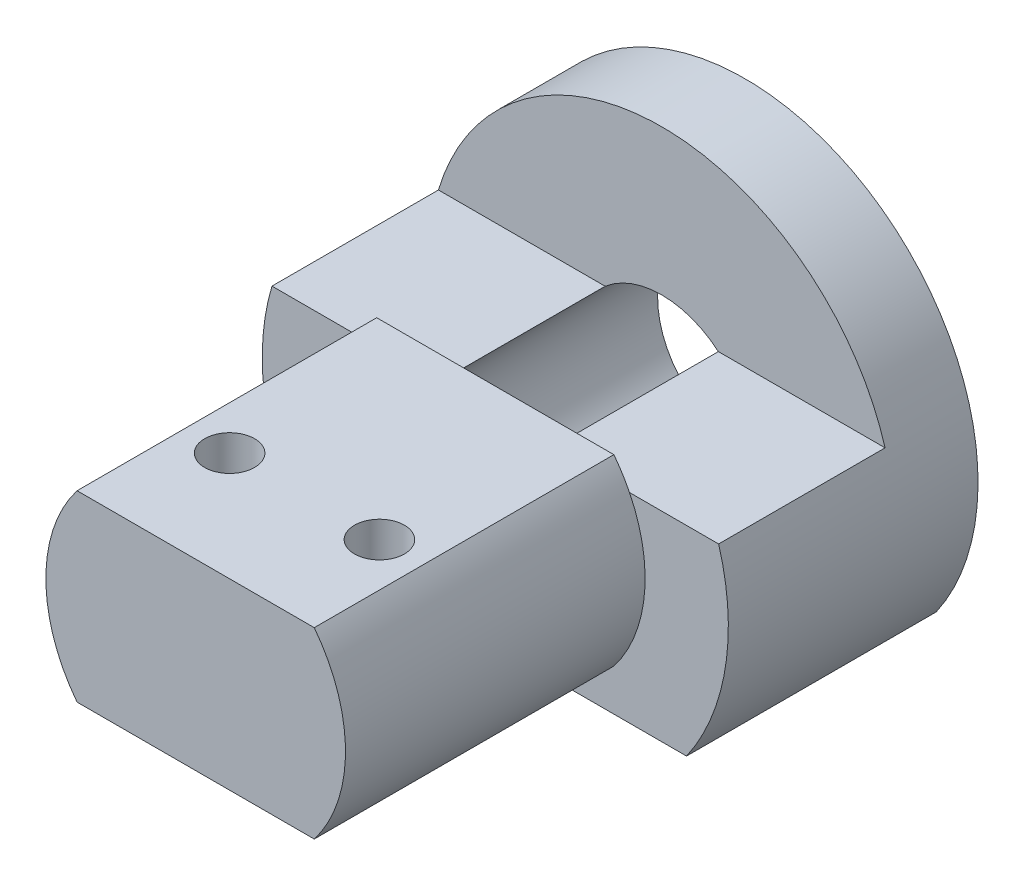
ISO-10303-21;
HEADER;
FILE_DESCRIPTION(('STEP AP214'),'2;1');
FILE_NAME('part.step','',(''),(''),'','','');
FILE_SCHEMA(('AUTOMOTIVE_DESIGN { 1 0 10303 214 1 1 1 1 }'));
ENDSEC;
DATA;
#1=APPLICATION_CONTEXT('core data for automotive mechanical design processes');
#2=APPLICATION_PROTOCOL_DEFINITION('international standard','automotive_design',2000,#1);
#3=PRODUCT_CONTEXT('',#1,'mechanical');
#4=PRODUCT('Part','Part','',(#3));
#5=PRODUCT_RELATED_PRODUCT_CATEGORY('part','',(#4));
#6=PRODUCT_DEFINITION_FORMATION('','',#4);
#7=PRODUCT_DEFINITION_CONTEXT('part definition',#1,'design');
#8=PRODUCT_DEFINITION('design','',#6,#7);
#9=PRODUCT_DEFINITION_SHAPE('','',#8);
#10=(LENGTH_UNIT() NAMED_UNIT(*) SI_UNIT(.MILLI.,.METRE.));
#11=(NAMED_UNIT(*) PLANE_ANGLE_UNIT() SI_UNIT($,.RADIAN.));
#12=(NAMED_UNIT(*) SI_UNIT($,.STERADIAN.) SOLID_ANGLE_UNIT());
#13=UNCERTAINTY_MEASURE_WITH_UNIT(LENGTH_MEASURE(1.E-05),#10,'distance_accuracy_value','');
#14=(GEOMETRIC_REPRESENTATION_CONTEXT(3) GLOBAL_UNCERTAINTY_ASSIGNED_CONTEXT((#13)) GLOBAL_UNIT_ASSIGNED_CONTEXT((#10,
#11,#12)) REPRESENTATION_CONTEXT('',''));
#15=CARTESIAN_POINT('',(0.,0.,0.));
#16=DIRECTION('',(0.,0.,1.));
#17=DIRECTION('',(1.,0.,0.));
#18=AXIS2_PLACEMENT_3D('',#15,#16,#17);
#19=CARTESIAN_POINT('',(0.,0.,15.));
#20=DIRECTION('',(0.,0.,1.));
#21=DIRECTION('',(1.,0.,0.));
#22=AXIS2_PLACEMENT_3D('',#19,#20,#21);
#23=PLANE('',#22);
#24=CARTESIAN_POINT('',(0.,0.,15.));
#25=DIRECTION('',(0.,0.,1.));
#26=DIRECTION('',(1.,0.,0.));
#27=AXIS2_PLACEMENT_3D('',#24,#25,#26);
#28=CIRCLE('',#27,9.);
#29=CARTESIAN_POINT('',(-8.06225774829855,4.,15.));
#30=VERTEX_POINT('',#29);
#31=CARTESIAN_POINT('',(-7.1239034243875,-5.5,15.));
#32=VERTEX_POINT('',#31);
#33=EDGE_CURVE('E11',#30,#32,#28,.T.);
#34=ORIENTED_EDGE('',*,*,#33,.F.);
#35=DIRECTION('',(1.,0.,0.));
#36=VECTOR('',#35,1.);
#37=CARTESIAN_POINT('',(-13.4164078649987,4.,15.));
#38=LINE('',#37,#36);
#39=CARTESIAN_POINT('',(-13.4164078649987,4.,15.));
#40=VERTEX_POINT('',#39);
#41=EDGE_CURVE('E145',#40,#30,#38,.T.);
#42=ORIENTED_EDGE('',*,*,#41,.F.);
#43=CARTESIAN_POINT('',(0.,0.,15.));
#44=DIRECTION('',(0.,0.,1.));
#45=DIRECTION('',(1.,0.,0.));
#46=AXIS2_PLACEMENT_3D('',#43,#44,#45);
#47=CIRCLE('',#46,14.);
#48=CARTESIAN_POINT('',(-11.4891252930761,-8.,15.));
#49=VERTEX_POINT('',#48);
#50=EDGE_CURVE('E171',#40,#49,#47,.T.);
#51=ORIENTED_EDGE('',*,*,#50,.T.);
#52=DIRECTION('',(1.,0.,0.));
#53=VECTOR('',#52,1.);
#54=CARTESIAN_POINT('',(-11.4891252930761,-8.,15.));
#55=LINE('',#54,#53);
#56=CARTESIAN_POINT('',(11.4891252930761,-8.,15.));
#57=VERTEX_POINT('',#56);
#58=EDGE_CURVE('E170',#49,#57,#55,.T.);
#59=ORIENTED_EDGE('',*,*,#58,.T.);
#60=CARTESIAN_POINT('',(13.4164078649987,4.,15.));
#61=VERTEX_POINT('',#60);
#62=EDGE_CURVE('E168',#57,#61,#47,.T.);
#63=ORIENTED_EDGE('',*,*,#62,.T.);
#64=CARTESIAN_POINT('',(8.06225774829855,4.,15.));
#65=VERTEX_POINT('',#64);
#66=EDGE_CURVE('E57',#65,#61,#38,.T.);
#67=ORIENTED_EDGE('',*,*,#66,.F.);
#68=CARTESIAN_POINT('',(0.,0.,15.));
#69=DIRECTION('',(0.,0.,1.));
#70=DIRECTION('',(1.,0.,0.));
#71=AXIS2_PLACEMENT_3D('',#68,#69,#70);
#72=CIRCLE('',#71,9.);
#73=CARTESIAN_POINT('',(7.1239034243875,-5.5,15.));
#74=VERTEX_POINT('',#73);
#75=EDGE_CURVE('E372',#74,#65,#72,.T.);
#76=ORIENTED_EDGE('',*,*,#75,.F.);
#77=DIRECTION('',(1.,0.,0.));
#78=VECTOR('',#77,1.);
#79=CARTESIAN_POINT('',(-7.1239034243875,-5.5,15.));
#80=LINE('',#79,#78);
#81=EDGE_CURVE('E52',#32,#74,#80,.T.);
#82=ORIENTED_EDGE('',*,*,#81,.F.);
#83=EDGE_LOOP('',(#34,#42,#51,#59,#63,#67,#76,#82));
#84=FACE_BOUND('',#83,.T.);
#85=ADVANCED_FACE('F35',(#84),#23,.T.);
#86=CARTESIAN_POINT('',(0.,0.,0.));
#87=DIRECTION('',(0.,0.,1.));
#88=DIRECTION('',(1.,0.,0.));
#89=AXIS2_PLACEMENT_3D('',#86,#87,#88);
#90=PLANE('',#89);
#91=CARTESIAN_POINT('',(0.,0.,0.));
#92=DIRECTION('',(0.,0.,1.));
#93=DIRECTION('',(1.,0.,0.));
#94=AXIS2_PLACEMENT_3D('',#91,#92,#93);
#95=CIRCLE('',#94,14.);
#96=CARTESIAN_POINT('',(11.4891252930761,-8.,0.));
#97=VERTEX_POINT('',#96);
#98=CARTESIAN_POINT('',(-11.4891252930761,-8.,0.));
#99=VERTEX_POINT('',#98);
#100=EDGE_CURVE('E165',#97,#99,#95,.T.);
#101=ORIENTED_EDGE('',*,*,#100,.F.);
#102=DIRECTION('',(1.,0.,0.));
#103=VECTOR('',#102,1.);
#104=CARTESIAN_POINT('',(-11.4891252930761,-8.,0.));
#105=LINE('',#104,#103);
#106=EDGE_CURVE('E176',#99,#97,#105,.T.);
#107=ORIENTED_EDGE('',*,*,#106,.F.);
#108=EDGE_LOOP('',(#101,#107));
#109=FACE_BOUND('',#108,.T.);
#110=CARTESIAN_POINT('',(0.,0.,0.));
#111=DIRECTION('',(0.,0.,1.));
#112=DIRECTION('',(1.,0.,0.));
#113=AXIS2_PLACEMENT_3D('',#110,#111,#112);
#114=CIRCLE('',#113,5.25);
#115=CARTESIAN_POINT('',(5.25,0.,0.));
#116=VERTEX_POINT('',#115);
#117=EDGE_CURVE('E160',#116,#116,#114,.T.);
#118=ORIENTED_EDGE('',*,*,#117,.T.);
#119=EDGE_LOOP('',(#118));
#120=FACE_BOUND('',#119,.T.);
#121=ADVANCED_FACE('F216',(#109,#120),#90,.F.);
#122=CARTESIAN_POINT('',(0.,0.,15.));
#123=DIRECTION('',(0.,0.,-1.));
#124=DIRECTION('',(-1.,0.,0.));
#125=AXIS2_PLACEMENT_3D('',#122,#123,#124);
#126=CYLINDRICAL_SURFACE('',#125,14.);
#127=ORIENTED_EDGE('',*,*,#50,.F.);
#128=DIRECTION('',(0.,0.,1.));
#129=VECTOR('',#128,1.);
#130=CARTESIAN_POINT('',(-13.4164078649987,4.,5.));
#131=LINE('',#130,#129);
#132=CARTESIAN_POINT('',(-13.4164078649987,4.,5.));
#133=VERTEX_POINT('',#132);
#134=EDGE_CURVE('E154',#133,#40,#131,.T.);
#135=ORIENTED_EDGE('',*,*,#134,.F.);
#136=CARTESIAN_POINT('',(0.,0.,5.));
#137=DIRECTION('',(0.,0.,1.));
#138=DIRECTION('',(1.,0.,0.));
#139=AXIS2_PLACEMENT_3D('',#136,#137,#138);
#140=CIRCLE('',#139,14.);
#141=CARTESIAN_POINT('',(13.4164078649987,4.,5.));
#142=VERTEX_POINT('',#141);
#143=EDGE_CURVE('E150',#142,#133,#140,.T.);
#144=ORIENTED_EDGE('',*,*,#143,.F.);
#145=DIRECTION('',(0.,0.,1.));
#146=VECTOR('',#145,1.);
#147=CARTESIAN_POINT('',(13.4164078649987,4.,5.));
#148=LINE('',#147,#146);
#149=EDGE_CURVE('E157',#142,#61,#148,.T.);
#150=ORIENTED_EDGE('',*,*,#149,.T.);
#151=ORIENTED_EDGE('',*,*,#62,.F.);
#152=DIRECTION('',(0.,0.,-1.));
#153=VECTOR('',#152,1.);
#154=CARTESIAN_POINT('',(11.4891252930761,-8.,15.));
#155=LINE('',#154,#153);
#156=EDGE_CURVE('E173',#57,#97,#155,.T.);
#157=ORIENTED_EDGE('',*,*,#156,.T.);
#158=ORIENTED_EDGE('',*,*,#100,.T.);
#159=DIRECTION('',(0.,0.,-1.));
#160=VECTOR('',#159,1.);
#161=CARTESIAN_POINT('',(-11.4891252930761,-8.,15.));
#162=LINE('',#161,#160);
#163=EDGE_CURVE('E180',#49,#99,#162,.T.);
#164=ORIENTED_EDGE('',*,*,#163,.F.);
#165=EDGE_LOOP('',(#127,#135,#144,#150,#151,#157,#158,#164));
#166=FACE_BOUND('',#165,.T.);
#167=ADVANCED_FACE('F37',(#166),#126,.T.);
#168=CARTESIAN_POINT('',(-11.4891252930761,-8.,15.));
#169=DIRECTION('',(0.,1.,0.));
#170=DIRECTION('',(0.,0.,1.));
#171=AXIS2_PLACEMENT_3D('',#168,#169,#170);
#172=PLANE('',#171);
#173=ORIENTED_EDGE('',*,*,#106,.T.);
#174=ORIENTED_EDGE('',*,*,#156,.F.);
#175=ORIENTED_EDGE('',*,*,#58,.F.);
#176=ORIENTED_EDGE('',*,*,#163,.T.);
#177=EDGE_LOOP('',(#173,#174,#175,#176));
#178=FACE_BOUND('',#177,.T.);
#179=ADVANCED_FACE('F213',(#178),#172,.F.);
#180=CARTESIAN_POINT('',(0.,0.,15.));
#181=DIRECTION('',(0.,0.,-1.));
#182=DIRECTION('',(-1.,0.,0.));
#183=AXIS2_PLACEMENT_3D('',#180,#181,#182);
#184=CYLINDRICAL_SURFACE('',#183,5.25);
#185=DIRECTION('',(0.,0.,-1.));
#186=VECTOR('',#185,1.);
#187=CARTESIAN_POINT('',(-3.40036762718386,4.,15.));
#188=LINE('',#187,#186);
#189=CARTESIAN_POINT('',(-3.40036762718386,4.,15.));
#190=VERTEX_POINT('',#189);
#191=CARTESIAN_POINT('',(-3.40036762718386,4.,5.));
#192=VERTEX_POINT('',#191);
#193=EDGE_CURVE('E39',#190,#192,#188,.T.);
#194=ORIENTED_EDGE('',*,*,#193,.F.);
#195=CARTESIAN_POINT('',(0.,0.,15.));
#196=DIRECTION('',(0.,0.,1.));
#197=DIRECTION('',(1.,0.,0.));
#198=AXIS2_PLACEMENT_3D('',#195,#196,#197);
#199=CIRCLE('',#198,5.25);
#200=CARTESIAN_POINT('',(3.40036762718386,4.,15.));
#201=VERTEX_POINT('',#200);
#202=EDGE_CURVE('E162',#190,#201,#199,.T.);
#203=ORIENTED_EDGE('',*,*,#202,.T.);
#204=DIRECTION('',(0.,0.,-1.));
#205=VECTOR('',#204,1.);
#206=CARTESIAN_POINT('',(3.40036762718386,4.,15.));
#207=LINE('',#206,#205);
#208=CARTESIAN_POINT('',(3.40036762718386,4.,5.));
#209=VERTEX_POINT('',#208);
#210=EDGE_CURVE('E185',#209,#201,#207,.F.);
#211=ORIENTED_EDGE('',*,*,#210,.F.);
#212=CARTESIAN_POINT('',(0.,0.,5.));
#213=DIRECTION('',(0.,0.,1.));
#214=DIRECTION('',(1.,0.,0.));
#215=AXIS2_PLACEMENT_3D('',#212,#213,#214);
#216=CIRCLE('',#215,5.25);
#217=EDGE_CURVE('E183',#209,#192,#216,.T.);
#218=ORIENTED_EDGE('',*,*,#217,.T.);
#219=EDGE_LOOP('',(#194,#203,#211,#218));
#220=FACE_BOUND('',#219,.T.);
#221=ORIENTED_EDGE('',*,*,#117,.F.);
#222=EDGE_LOOP('',(#221));
#223=FACE_BOUND('',#222,.T.);
#224=ADVANCED_FACE('F198',(#220,#223),#184,.F.);
#225=CARTESIAN_POINT('',(-13.4164078649987,4.,5.));
#226=DIRECTION('',(0.,-1.,0.));
#227=DIRECTION('',(0.,0.,-1.));
#228=AXIS2_PLACEMENT_3D('',#225,#226,#227);
#229=PLANE('',#228);
#230=ORIENTED_EDGE('',*,*,#193,.T.);
#231=DIRECTION('',(1.,0.,0.));
#232=VECTOR('',#231,1.);
#233=CARTESIAN_POINT('',(-13.4164078649987,4.,5.));
#234=LINE('',#233,#232);
#235=EDGE_CURVE('E153',#133,#192,#234,.T.);
#236=ORIENTED_EDGE('',*,*,#235,.F.);
#237=ORIENTED_EDGE('',*,*,#134,.T.);
#238=ORIENTED_EDGE('',*,*,#41,.T.);
#239=EDGE_CURVE('E144',#30,#190,#38,.T.);
#240=ORIENTED_EDGE('',*,*,#239,.T.);
#241=EDGE_LOOP('',(#230,#236,#237,#238,#240));
#242=FACE_BOUND('',#241,.T.);
#243=ADVANCED_FACE('F193',(#242),#229,.F.);
#244=ORIENTED_EDGE('',*,*,#210,.T.);
#245=EDGE_CURVE('E142',#201,#65,#38,.T.);
#246=ORIENTED_EDGE('',*,*,#245,.T.);
#247=ORIENTED_EDGE('',*,*,#66,.T.);
#248=ORIENTED_EDGE('',*,*,#149,.F.);
#249=EDGE_CURVE('E152',#209,#142,#234,.T.);
#250=ORIENTED_EDGE('',*,*,#249,.F.);
#251=EDGE_LOOP('',(#244,#246,#247,#248,#250));
#252=FACE_BOUND('',#251,.T.);
#253=ADVANCED_FACE('F203',(#252),#229,.F.);
#254=CARTESIAN_POINT('',(0.,0.,5.));
#255=DIRECTION('',(0.,0.,1.));
#256=DIRECTION('',(1.,0.,0.));
#257=AXIS2_PLACEMENT_3D('',#254,#255,#256);
#258=PLANE('',#257);
#259=ORIENTED_EDGE('',*,*,#249,.T.);
#260=ORIENTED_EDGE('',*,*,#143,.T.);
#261=ORIENTED_EDGE('',*,*,#235,.T.);
#262=ORIENTED_EDGE('',*,*,#217,.F.);
#263=EDGE_LOOP('',(#259,#260,#261,#262));
#264=FACE_BOUND('',#263,.T.);
#265=ADVANCED_FACE('F201',(#264),#258,.T.);
#266=CARTESIAN_POINT('',(0.,0.,33.));
#267=DIRECTION('',(0.,0.,-1.));
#268=DIRECTION('',(-1.,0.,0.));
#269=AXIS2_PLACEMENT_3D('',#266,#267,#268);
#270=CYLINDRICAL_SURFACE('',#269,9.);
#271=CARTESIAN_POINT('',(-7.1239034243875,5.5,15.));
#272=VERTEX_POINT('',#271);
#273=EDGE_CURVE('E45',#272,#30,#28,.T.);
#274=ORIENTED_EDGE('',*,*,#273,.T.);
#275=ORIENTED_EDGE('',*,*,#33,.T.);
#276=DIRECTION('',(0.,0.,-1.));
#277=VECTOR('',#276,1.);
#278=CARTESIAN_POINT('',(-7.1239034243875,-5.5,33.));
#279=LINE('',#278,#277);
#280=CARTESIAN_POINT('',(-7.1239034243875,-5.5,33.));
#281=VERTEX_POINT('',#280);
#282=EDGE_CURVE('E122',#281,#32,#279,.T.);
#283=ORIENTED_EDGE('',*,*,#282,.F.);
#284=CARTESIAN_POINT('',(0.,0.,33.));
#285=DIRECTION('',(0.,0.,1.));
#286=DIRECTION('',(1.,0.,0.));
#287=AXIS2_PLACEMENT_3D('',#284,#285,#286);
#288=CIRCLE('',#287,9.);
#289=CARTESIAN_POINT('',(-7.1239034243875,5.5,33.));
#290=VERTEX_POINT('',#289);
#291=EDGE_CURVE('E128',#290,#281,#288,.T.);
#292=ORIENTED_EDGE('',*,*,#291,.F.);
#293=DIRECTION('',(0.,0.,-1.));
#294=VECTOR('',#293,1.);
#295=CARTESIAN_POINT('',(-7.1239034243875,5.5,33.));
#296=LINE('',#295,#294);
#297=EDGE_CURVE('E368',#290,#272,#296,.T.);
#298=ORIENTED_EDGE('',*,*,#297,.T.);
#299=EDGE_LOOP('',(#274,#275,#283,#292,#298));
#300=FACE_BOUND('',#299,.T.);
#301=ADVANCED_FACE('F140',(#300),#270,.T.);
#302=CARTESIAN_POINT('',(-7.1239034243875,-5.5,33.));
#303=DIRECTION('',(0.,1.,0.));
#304=DIRECTION('',(-1.,0.,0.));
#305=AXIS2_PLACEMENT_3D('',#302,#303,#304);
#306=PLANE('',#305);
#307=CARTESIAN_POINT('',(-4.5,-5.5,26.46));
#308=DIRECTION('',(0.,1.,0.));
#309=DIRECTION('',(-1.,0.,0.));
#310=AXIS2_PLACEMENT_3D('',#307,#308,#309);
#311=CIRCLE('',#310,1.5);
#312=CARTESIAN_POINT('',(-6.,-5.5,26.46));
#313=VERTEX_POINT('',#312);
#314=EDGE_CURVE('E357',#313,#313,#311,.T.);
#315=ORIENTED_EDGE('',*,*,#314,.T.);
#316=EDGE_LOOP('',(#315));
#317=FACE_BOUND('',#316,.T.);
#318=CARTESIAN_POINT('',(4.5,-5.5,26.46));
#319=DIRECTION('',(0.,1.,0.));
#320=DIRECTION('',(-1.,0.,0.));
#321=AXIS2_PLACEMENT_3D('',#318,#319,#320);
#322=CIRCLE('',#321,1.5);
#323=CARTESIAN_POINT('',(3.,-5.5,26.46));
#324=VERTEX_POINT('',#323);
#325=EDGE_CURVE('E361',#324,#324,#322,.T.);
#326=ORIENTED_EDGE('',*,*,#325,.T.);
#327=EDGE_LOOP('',(#326));
#328=FACE_BOUND('',#327,.T.);
#329=ORIENTED_EDGE('',*,*,#81,.T.);
#330=DIRECTION('',(0.,0.,-1.));
#331=VECTOR('',#330,1.);
#332=CARTESIAN_POINT('',(7.1239034243875,-5.5,33.));
#333=LINE('',#332,#331);
#334=CARTESIAN_POINT('',(7.1239034243875,-5.5,33.));
#335=VERTEX_POINT('',#334);
#336=EDGE_CURVE('E124',#335,#74,#333,.T.);
#337=ORIENTED_EDGE('',*,*,#336,.F.);
#338=DIRECTION('',(1.,0.,0.));
#339=VECTOR('',#338,1.);
#340=CARTESIAN_POINT('',(-7.1239034243875,-5.5,33.));
#341=LINE('',#340,#339);
#342=EDGE_CURVE('E118',#281,#335,#341,.T.);
#343=ORIENTED_EDGE('',*,*,#342,.F.);
#344=ORIENTED_EDGE('',*,*,#282,.T.);
#345=EDGE_LOOP('',(#329,#337,#343,#344));
#346=FACE_BOUND('',#345,.T.);
#347=ADVANCED_FACE('F120',(#317,#328,#346),#306,.F.);
#348=CARTESIAN_POINT('',(0.,0.,33.));
#349=DIRECTION('',(0.,0.,-1.));
#350=DIRECTION('',(-1.,0.,0.));
#351=AXIS2_PLACEMENT_3D('',#348,#349,#350);
#352=CYLINDRICAL_SURFACE('',#351,9.);
#353=ORIENTED_EDGE('',*,*,#75,.T.);
#354=CARTESIAN_POINT('',(7.1239034243875,5.5,15.));
#355=VERTEX_POINT('',#354);
#356=EDGE_CURVE('E371',#65,#355,#72,.T.);
#357=ORIENTED_EDGE('',*,*,#356,.T.);
#358=DIRECTION('',(0.,0.,-1.));
#359=VECTOR('',#358,1.);
#360=CARTESIAN_POINT('',(7.1239034243875,5.5,33.));
#361=LINE('',#360,#359);
#362=CARTESIAN_POINT('',(7.1239034243875,5.5,33.));
#363=VERTEX_POINT('',#362);
#364=EDGE_CURVE('E146',#363,#355,#361,.T.);
#365=ORIENTED_EDGE('',*,*,#364,.F.);
#366=CARTESIAN_POINT('',(0.,0.,33.));
#367=DIRECTION('',(0.,0.,1.));
#368=DIRECTION('',(1.,0.,0.));
#369=AXIS2_PLACEMENT_3D('',#366,#367,#368);
#370=CIRCLE('',#369,9.);
#371=EDGE_CURVE('E127',#335,#363,#370,.T.);
#372=ORIENTED_EDGE('',*,*,#371,.F.);
#373=ORIENTED_EDGE('',*,*,#336,.T.);
#374=EDGE_LOOP('',(#353,#357,#365,#372,#373));
#375=FACE_BOUND('',#374,.T.);
#376=ADVANCED_FACE('F287',(#375),#352,.T.);
#377=CARTESIAN_POINT('',(-7.1239034243875,5.5,33.));
#378=DIRECTION('',(0.,-1.,0.));
#379=DIRECTION('',(0.,0.,-1.));
#380=AXIS2_PLACEMENT_3D('',#377,#378,#379);
#381=PLANE('',#380);
#382=CARTESIAN_POINT('',(-4.5,5.5,26.46));
#383=DIRECTION('',(0.,1.,0.));
#384=DIRECTION('',(0.,0.,-1.));
#385=AXIS2_PLACEMENT_3D('',#382,#383,#384);
#386=CIRCLE('',#385,1.5);
#387=CARTESIAN_POINT('',(-4.5,5.5,24.96));
#388=VERTEX_POINT('',#387);
#389=EDGE_CURVE('E354',#388,#388,#386,.T.);
#390=ORIENTED_EDGE('',*,*,#389,.F.);
#391=EDGE_LOOP('',(#390));
#392=FACE_BOUND('',#391,.T.);
#393=CARTESIAN_POINT('',(4.5,5.5,26.46));
#394=DIRECTION('',(0.,1.,0.));
#395=DIRECTION('',(0.,0.,1.));
#396=AXIS2_PLACEMENT_3D('',#393,#394,#395);
#397=CIRCLE('',#396,1.5);
#398=CARTESIAN_POINT('',(4.5,5.5,27.96));
#399=VERTEX_POINT('',#398);
#400=EDGE_CURVE('E358',#399,#399,#397,.T.);
#401=ORIENTED_EDGE('',*,*,#400,.F.);
#402=EDGE_LOOP('',(#401));
#403=FACE_BOUND('',#402,.T.);
#404=DIRECTION('',(-1.,0.,0.));
#405=VECTOR('',#404,1.);
#406=CARTESIAN_POINT('',(-7.1239034243875,5.5,15.));
#407=LINE('',#406,#405);
#408=EDGE_CURVE('E137',#355,#272,#407,.T.);
#409=ORIENTED_EDGE('',*,*,#408,.T.);
#410=ORIENTED_EDGE('',*,*,#297,.F.);
#411=DIRECTION('',(-1.,0.,0.));
#412=VECTOR('',#411,1.);
#413=CARTESIAN_POINT('',(-7.1239034243875,5.5,33.));
#414=LINE('',#413,#412);
#415=EDGE_CURVE('E133',#363,#290,#414,.T.);
#416=ORIENTED_EDGE('',*,*,#415,.F.);
#417=ORIENTED_EDGE('',*,*,#364,.T.);
#418=EDGE_LOOP('',(#409,#410,#416,#417));
#419=FACE_BOUND('',#418,.T.);
#420=ADVANCED_FACE('F297',(#392,#403,#419),#381,.F.);
#421=CARTESIAN_POINT('',(0.,0.,33.));
#422=DIRECTION('',(0.,0.,1.));
#423=DIRECTION('',(1.,0.,0.));
#424=AXIS2_PLACEMENT_3D('',#421,#422,#423);
#425=PLANE('',#424);
#426=ORIENTED_EDGE('',*,*,#291,.T.);
#427=ORIENTED_EDGE('',*,*,#342,.T.);
#428=ORIENTED_EDGE('',*,*,#371,.T.);
#429=ORIENTED_EDGE('',*,*,#415,.T.);
#430=EDGE_LOOP('',(#426,#427,#428,#429));
#431=FACE_BOUND('',#430,.T.);
#432=ADVANCED_FACE('F131',(#431),#425,.T.);
#433=CARTESIAN_POINT('',(0.,0.,15.));
#434=DIRECTION('',(0.,0.,1.));
#435=DIRECTION('',(1.,0.,0.));
#436=AXIS2_PLACEMENT_3D('',#433,#434,#435);
#437=PLANE('',#436);
#438=ORIENTED_EDGE('',*,*,#239,.F.);
#439=ORIENTED_EDGE('',*,*,#273,.F.);
#440=ORIENTED_EDGE('',*,*,#408,.F.);
#441=ORIENTED_EDGE('',*,*,#356,.F.);
#442=ORIENTED_EDGE('',*,*,#245,.F.);
#443=ORIENTED_EDGE('',*,*,#202,.F.);
#444=EDGE_LOOP('',(#438,#439,#440,#441,#442,#443));
#445=FACE_BOUND('',#444,.T.);
#446=ADVANCED_FACE('F314',(#445),#437,.F.);
#447=CARTESIAN_POINT('',(4.5,-8.,26.46));
#448=DIRECTION('',(0.,1.,0.));
#449=DIRECTION('',(0.,0.,1.));
#450=AXIS2_PLACEMENT_3D('',#447,#448,#449);
#451=CYLINDRICAL_SURFACE('',#450,1.5);
#452=ORIENTED_EDGE('',*,*,#400,.T.);
#453=EDGE_LOOP('',(#452));
#454=FACE_BOUND('',#453,.T.);
#455=ORIENTED_EDGE('',*,*,#325,.F.);
#456=EDGE_LOOP('',(#455));
#457=FACE_BOUND('',#456,.T.);
#458=ADVANCED_FACE('F321',(#454,#457),#451,.F.);
#459=CARTESIAN_POINT('',(-4.5,-8.,26.46));
#460=DIRECTION('',(0.,1.,0.));
#461=DIRECTION('',(0.,0.,1.));
#462=AXIS2_PLACEMENT_3D('',#459,#460,#461);
#463=CYLINDRICAL_SURFACE('',#462,1.5);
#464=ORIENTED_EDGE('',*,*,#389,.T.);
#465=EDGE_LOOP('',(#464));
#466=FACE_BOUND('',#465,.T.);
#467=ORIENTED_EDGE('',*,*,#314,.F.);
#468=EDGE_LOOP('',(#467));
#469=FACE_BOUND('',#468,.T.);
#470=ADVANCED_FACE('F329',(#466,#469),#463,.F.);
#471=CLOSED_SHELL('',(#85,#121,#167,#179,#224,#243,#253,#265,#301,#347,#376,#420,#432,#446,#458,#470));
#472=MANIFOLD_SOLID_BREP('B2',#471);
#473=ADVANCED_BREP_SHAPE_REPRESENTATION('',(#18,#472),#14);
#474=SHAPE_DEFINITION_REPRESENTATION(#9,#473);
ENDSEC;
END-ISO-10303-21;
